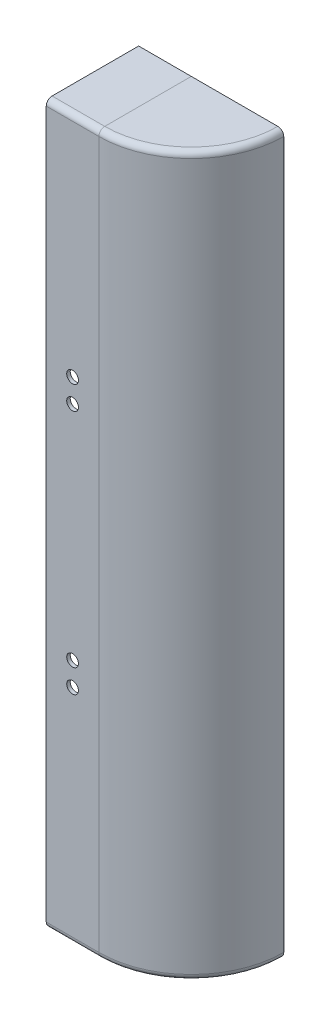
ISO-10303-21;
HEADER;
FILE_DESCRIPTION(('STEP AP214'),'2;1');
FILE_NAME('part.step','',(''),(''),'','','');
FILE_SCHEMA(('AUTOMOTIVE_DESIGN { 1 0 10303 214 1 1 1 1 }'));
ENDSEC;
DATA;
#1=APPLICATION_CONTEXT('core data for automotive mechanical design processes');
#2=APPLICATION_PROTOCOL_DEFINITION('international standard','automotive_design',2000,#1);
#3=PRODUCT_CONTEXT('',#1,'mechanical');
#4=PRODUCT('Part','Part','',(#3));
#5=PRODUCT_RELATED_PRODUCT_CATEGORY('part','',(#4));
#6=PRODUCT_DEFINITION_FORMATION('','',#4);
#7=PRODUCT_DEFINITION_CONTEXT('part definition',#1,'design');
#8=PRODUCT_DEFINITION('design','',#6,#7);
#9=PRODUCT_DEFINITION_SHAPE('','',#8);
#10=(LENGTH_UNIT() NAMED_UNIT(*) SI_UNIT(.MILLI.,.METRE.));
#11=(NAMED_UNIT(*) PLANE_ANGLE_UNIT() SI_UNIT($,.RADIAN.));
#12=(NAMED_UNIT(*) SI_UNIT($,.STERADIAN.) SOLID_ANGLE_UNIT());
#13=UNCERTAINTY_MEASURE_WITH_UNIT(LENGTH_MEASURE(1.E-05),#10,'distance_accuracy_value','');
#14=(GEOMETRIC_REPRESENTATION_CONTEXT(3) GLOBAL_UNCERTAINTY_ASSIGNED_CONTEXT((#13)) GLOBAL_UNIT_ASSIGNED_CONTEXT((#10,
#11,#12)) REPRESENTATION_CONTEXT('',''));
#15=CARTESIAN_POINT('',(0.,0.,0.));
#16=DIRECTION('',(0.,0.,1.));
#17=DIRECTION('',(1.,0.,0.));
#18=AXIS2_PLACEMENT_3D('',#15,#16,#17);
#19=CARTESIAN_POINT('',(5.00000000000474,267.103854728123,0.));
#20=DIRECTION('',(-1.,0.,0.));
#21=DIRECTION('',(0.,-1.,0.));
#22=AXIS2_PLACEMENT_3D('',#19,#20,#21);
#23=PLANE('',#22);
#24=DIRECTION('',(0.,1.,0.));
#25=VECTOR('',#24,1.);
#26=CARTESIAN_POINT('',(5.00000000000474,0.,1.5));
#27=LINE('',#26,#25);
#28=CARTESIAN_POINT('',(5.00000000000474,267.103854728123,1.49999999999999));
#29=VERTEX_POINT('',#28);
#30=CARTESIAN_POINT('',(5.00000000000474,-34.8961452718771,1.5));
#31=VERTEX_POINT('',#30);
#32=EDGE_CURVE('E482',#29,#31,#27,.F.);
#33=ORIENTED_EDGE('',*,*,#32,.F.);
#34=DIRECTION('',(0.,0.,-1.));
#35=VECTOR('',#34,1.);
#36=CARTESIAN_POINT('',(5.00000000000474,267.103854728123,0.));
#37=LINE('',#36,#35);
#38=CARTESIAN_POINT('',(5.00000000000474,267.103854728123,0.));
#39=VERTEX_POINT('',#38);
#40=EDGE_CURVE('E13',#29,#39,#37,.T.);
#41=ORIENTED_EDGE('',*,*,#40,.T.);
#42=DIRECTION('',(0.,-1.,0.));
#43=VECTOR('',#42,1.);
#44=CARTESIAN_POINT('',(5.00000000000474,267.103854728123,0.));
#45=LINE('',#44,#43);
#46=CARTESIAN_POINT('',(5.00000000000474,-34.8961452718771,0.));
#47=VERTEX_POINT('',#46);
#48=EDGE_CURVE('E460',#39,#47,#45,.T.);
#49=ORIENTED_EDGE('',*,*,#48,.T.);
#50=DIRECTION('',(0.,0.,-1.));
#51=VECTOR('',#50,1.);
#52=CARTESIAN_POINT('',(5.00000000000474,-34.8961452718771,0.));
#53=LINE('',#52,#51);
#54=EDGE_CURVE('E161',#31,#47,#53,.T.);
#55=ORIENTED_EDGE('',*,*,#54,.F.);
#56=EDGE_LOOP('',(#33,#41,#49,#55));
#57=FACE_BOUND('',#56,.T.);
#58=ADVANCED_FACE('F157',(#57),#23,.T.);
#59=CARTESIAN_POINT('',(16.2500000000044,57.6023073405395,0.));
#60=DIRECTION('',(0.,0.,1.));
#61=DIRECTION('',(1.,0.,0.));
#62=AXIS2_PLACEMENT_3D('',#59,#60,#61);
#63=CYLINDRICAL_SURFACE('',#62,2.5);
#64=CARTESIAN_POINT('',(16.2500000000044,57.6023073405395,0.));
#65=DIRECTION('',(0.,0.,1.));
#66=DIRECTION('',(1.,0.,0.));
#67=AXIS2_PLACEMENT_3D('',#64,#65,#66);
#68=CIRCLE('',#67,2.5);
#69=CARTESIAN_POINT('',(18.7500000000044,57.6023073405395,0.));
#70=VERTEX_POINT('',#69);
#71=EDGE_CURVE('E468',#70,#70,#68,.T.);
#72=ORIENTED_EDGE('',*,*,#71,.F.);
#73=EDGE_LOOP('',(#72));
#74=FACE_BOUND('',#73,.T.);
#75=CARTESIAN_POINT('',(16.2500000000044,57.6023073405395,1.5));
#76=DIRECTION('',(0.,0.,1.));
#77=DIRECTION('',(1.,0.,0.));
#78=AXIS2_PLACEMENT_3D('',#75,#76,#77);
#79=CIRCLE('',#78,2.5);
#80=CARTESIAN_POINT('',(18.7500000000044,57.6023073405395,1.5));
#81=VERTEX_POINT('',#80);
#82=EDGE_CURVE('E486',#81,#81,#79,.T.);
#83=ORIENTED_EDGE('',*,*,#82,.T.);
#84=EDGE_LOOP('',(#83));
#85=FACE_BOUND('',#84,.T.);
#86=ADVANCED_FACE('F521',(#74,#85),#63,.F.);
#87=CARTESIAN_POINT('',(16.2500000000045,67.6023073405395,0.));
#88=DIRECTION('',(0.,0.,1.));
#89=DIRECTION('',(1.,0.,0.));
#90=AXIS2_PLACEMENT_3D('',#87,#88,#89);
#91=CYLINDRICAL_SURFACE('',#90,2.5);
#92=CARTESIAN_POINT('',(16.2500000000045,67.6023073405395,0.));
#93=DIRECTION('',(0.,0.,1.));
#94=DIRECTION('',(1.,0.,0.));
#95=AXIS2_PLACEMENT_3D('',#92,#93,#94);
#96=CIRCLE('',#95,2.5);
#97=CARTESIAN_POINT('',(18.7500000000045,67.6023073405395,0.));
#98=VERTEX_POINT('',#97);
#99=EDGE_CURVE('E471',#98,#98,#96,.T.);
#100=ORIENTED_EDGE('',*,*,#99,.F.);
#101=EDGE_LOOP('',(#100));
#102=FACE_BOUND('',#101,.T.);
#103=CARTESIAN_POINT('',(16.2500000000045,67.6023073405395,1.5));
#104=DIRECTION('',(0.,0.,1.));
#105=DIRECTION('',(1.,0.,0.));
#106=AXIS2_PLACEMENT_3D('',#103,#104,#105);
#107=CIRCLE('',#106,2.5);
#108=CARTESIAN_POINT('',(18.7500000000045,67.6023073405395,1.5));
#109=VERTEX_POINT('',#108);
#110=EDGE_CURVE('E494',#109,#109,#107,.T.);
#111=ORIENTED_EDGE('',*,*,#110,.T.);
#112=EDGE_LOOP('',(#111));
#113=FACE_BOUND('',#112,.T.);
#114=ADVANCED_FACE('F526',(#102,#113),#91,.F.);
#115=CARTESIAN_POINT('',(16.2500000000051,162.445102934797,0.));
#116=DIRECTION('',(0.,0.,1.));
#117=DIRECTION('',(1.,0.,0.));
#118=AXIS2_PLACEMENT_3D('',#115,#116,#117);
#119=CYLINDRICAL_SURFACE('',#118,2.5);
#120=CARTESIAN_POINT('',(16.2500000000051,162.445102934797,0.));
#121=DIRECTION('',(0.,0.,1.));
#122=DIRECTION('',(1.,0.,0.));
#123=AXIS2_PLACEMENT_3D('',#120,#121,#122);
#124=CIRCLE('',#123,2.5);
#125=CARTESIAN_POINT('',(18.7500000000051,162.445102934797,0.));
#126=VERTEX_POINT('',#125);
#127=EDGE_CURVE('E474',#126,#126,#124,.T.);
#128=ORIENTED_EDGE('',*,*,#127,.F.);
#129=EDGE_LOOP('',(#128));
#130=FACE_BOUND('',#129,.T.);
#131=CARTESIAN_POINT('',(16.2500000000051,162.445102934797,1.5));
#132=DIRECTION('',(0.,0.,1.));
#133=DIRECTION('',(1.,0.,0.));
#134=AXIS2_PLACEMENT_3D('',#131,#132,#133);
#135=CIRCLE('',#134,2.5);
#136=CARTESIAN_POINT('',(18.7500000000051,162.445102934797,1.5));
#137=VERTEX_POINT('',#136);
#138=EDGE_CURVE('E497',#137,#137,#135,.T.);
#139=ORIENTED_EDGE('',*,*,#138,.T.);
#140=EDGE_LOOP('',(#139));
#141=FACE_BOUND('',#140,.T.);
#142=ADVANCED_FACE('F532',(#130,#141),#119,.F.);
#143=CARTESIAN_POINT('',(16.2500000000052,172.445102934797,0.));
#144=DIRECTION('',(0.,0.,1.));
#145=DIRECTION('',(1.,0.,0.));
#146=AXIS2_PLACEMENT_3D('',#143,#144,#145);
#147=CYLINDRICAL_SURFACE('',#146,2.5);
#148=CARTESIAN_POINT('',(16.2500000000052,172.445102934797,0.));
#149=DIRECTION('',(0.,0.,1.));
#150=DIRECTION('',(1.,0.,0.));
#151=AXIS2_PLACEMENT_3D('',#148,#149,#150);
#152=CIRCLE('',#151,2.5);
#153=CARTESIAN_POINT('',(18.7500000000052,172.445102934797,0.));
#154=VERTEX_POINT('',#153);
#155=EDGE_CURVE('E477',#154,#154,#152,.T.);
#156=ORIENTED_EDGE('',*,*,#155,.F.);
#157=EDGE_LOOP('',(#156));
#158=FACE_BOUND('',#157,.T.);
#159=CARTESIAN_POINT('',(16.2500000000052,172.445102934797,1.5));
#160=DIRECTION('',(0.,0.,1.));
#161=DIRECTION('',(1.,0.,0.));
#162=AXIS2_PLACEMENT_3D('',#159,#160,#161);
#163=CIRCLE('',#162,2.5);
#164=CARTESIAN_POINT('',(18.7500000000052,172.445102934797,1.5));
#165=VERTEX_POINT('',#164);
#166=EDGE_CURVE('E461',#165,#165,#163,.T.);
#167=ORIENTED_EDGE('',*,*,#166,.T.);
#168=EDGE_LOOP('',(#167));
#169=FACE_BOUND('',#168,.T.);
#170=ADVANCED_FACE('F159',(#158,#169),#147,.F.);
#171=CARTESIAN_POINT('',(0.,0.,0.));
#172=DIRECTION('',(0.,0.,1.));
#173=DIRECTION('',(1.,0.,0.));
#174=AXIS2_PLACEMENT_3D('',#171,#172,#173);
#175=PLANE('',#174);
#176=DIRECTION('',(1.,0.,0.));
#177=VECTOR('',#176,1.);
#178=CARTESIAN_POINT('',(5.00000000000474,-34.8961452718771,0.));
#179=LINE('',#178,#177);
#180=CARTESIAN_POINT('',(27.5000000000047,-34.8961452718772,0.));
#181=VERTEX_POINT('',#180);
#182=EDGE_CURVE('E172',#47,#181,#179,.T.);
#183=ORIENTED_EDGE('',*,*,#182,.F.);
#184=ORIENTED_EDGE('',*,*,#48,.F.);
#185=DIRECTION('',(-1.,0.,0.));
#186=VECTOR('',#185,1.);
#187=CARTESIAN_POINT('',(27.5000000000048,267.103854728123,0.));
#188=LINE('',#187,#186);
#189=CARTESIAN_POINT('',(27.5000000000049,267.103854728123,0.));
#190=VERTEX_POINT('',#189);
#191=EDGE_CURVE('E463',#190,#39,#188,.T.);
#192=ORIENTED_EDGE('',*,*,#191,.F.);
#193=DIRECTION('',(0.,1.,0.));
#194=VECTOR('',#193,1.);
#195=CARTESIAN_POINT('',(27.5000000000048,-34.8961452718772,0.));
#196=LINE('',#195,#194);
#197=EDGE_CURVE('E465',#181,#190,#196,.T.);
#198=ORIENTED_EDGE('',*,*,#197,.F.);
#199=EDGE_LOOP('',(#183,#184,#192,#198));
#200=FACE_BOUND('',#199,.T.);
#201=ORIENTED_EDGE('',*,*,#71,.T.);
#202=EDGE_LOOP('',(#201));
#203=FACE_BOUND('',#202,.T.);
#204=ORIENTED_EDGE('',*,*,#99,.T.);
#205=EDGE_LOOP('',(#204));
#206=FACE_BOUND('',#205,.T.);
#207=ORIENTED_EDGE('',*,*,#127,.T.);
#208=EDGE_LOOP('',(#207));
#209=FACE_BOUND('',#208,.T.);
#210=ORIENTED_EDGE('',*,*,#155,.T.);
#211=EDGE_LOOP('',(#210));
#212=FACE_BOUND('',#211,.T.);
#213=ADVANCED_FACE('F507',(#200,#203,#206,#209,#212),#175,.F.);
#214=CARTESIAN_POINT('',(0.,0.,1.5));
#215=DIRECTION('',(0.,0.,1.));
#216=DIRECTION('',(1.,0.,0.));
#217=AXIS2_PLACEMENT_3D('',#214,#215,#216);
#218=PLANE('',#217);
#219=DIRECTION('',(1.,0.,0.));
#220=VECTOR('',#219,1.);
#221=CARTESIAN_POINT('',(0.,-34.8961452718771,1.5));
#222=LINE('',#221,#220);
#223=CARTESIAN_POINT('',(27.5000000000048,-34.8961452718772,1.50000000000001));
#224=VERTEX_POINT('',#223);
#225=EDGE_CURVE('E451',#31,#224,#222,.T.);
#226=ORIENTED_EDGE('',*,*,#225,.T.);
#227=DIRECTION('',(0.,1.,0.));
#228=VECTOR('',#227,1.);
#229=CARTESIAN_POINT('',(27.5000000000048,0.,1.5));
#230=LINE('',#229,#228);
#231=CARTESIAN_POINT('',(27.5000000000049,267.103854728123,1.50000000000002));
#232=VERTEX_POINT('',#231);
#233=EDGE_CURVE('E483',#224,#232,#230,.T.);
#234=ORIENTED_EDGE('',*,*,#233,.T.);
#235=DIRECTION('',(1.,0.,0.));
#236=VECTOR('',#235,1.);
#237=CARTESIAN_POINT('',(0.,267.103854728123,1.5));
#238=LINE('',#237,#236);
#239=EDGE_CURVE('E487',#232,#29,#238,.F.);
#240=ORIENTED_EDGE('',*,*,#239,.T.);
#241=ORIENTED_EDGE('',*,*,#32,.T.);
#242=EDGE_LOOP('',(#226,#234,#240,#241));
#243=FACE_BOUND('',#242,.T.);
#244=ORIENTED_EDGE('',*,*,#82,.F.);
#245=EDGE_LOOP('',(#244));
#246=FACE_BOUND('',#245,.T.);
#247=ORIENTED_EDGE('',*,*,#110,.F.);
#248=EDGE_LOOP('',(#247));
#249=FACE_BOUND('',#248,.T.);
#250=ORIENTED_EDGE('',*,*,#138,.F.);
#251=EDGE_LOOP('',(#250));
#252=FACE_BOUND('',#251,.T.);
#253=ORIENTED_EDGE('',*,*,#166,.F.);
#254=EDGE_LOOP('',(#253));
#255=FACE_BOUND('',#254,.T.);
#256=ADVANCED_FACE('F504',(#243,#246,#249,#252,#255),#218,.T.);
#257=CARTESIAN_POINT('',(27.5000000000049,-34.8961452718772,-38.));
#258=DIRECTION('',(0.,-1.,0.));
#259=DIRECTION('',(1.,0.,0.));
#260=AXIS2_PLACEMENT_3D('',#257,#258,#259);
#261=CYLINDRICAL_SURFACE('',#260,39.5);
#262=ORIENTED_EDGE('',*,*,#233,.F.);
#263=CARTESIAN_POINT('',(27.5000000000049,-34.8961452718772,-38.));
#264=DIRECTION('',(0.,-1.,0.));
#265=DIRECTION('',(0.,0.,-1.));
#266=AXIS2_PLACEMENT_3D('',#263,#264,#265);
#267=CIRCLE('',#266,39.5);
#268=CARTESIAN_POINT('',(67.0000000000049,-34.8961452718772,-37.9999999999999));
#269=VERTEX_POINT('',#268);
#270=EDGE_CURVE('E452',#269,#224,#267,.T.);
#271=ORIENTED_EDGE('',*,*,#270,.F.);
#272=DIRECTION('',(0.,-1.,0.));
#273=VECTOR('',#272,1.);
#274=CARTESIAN_POINT('',(67.0000000000049,267.103854728123,-37.9999999999999));
#275=LINE('',#274,#273);
#276=CARTESIAN_POINT('',(67.0000000000049,267.103854728123,-37.9999999999999));
#277=VERTEX_POINT('',#276);
#278=EDGE_CURVE('E440',#269,#277,#275,.F.);
#279=ORIENTED_EDGE('',*,*,#278,.T.);
#280=CARTESIAN_POINT('',(27.5000000000049,267.103854728123,-38.));
#281=DIRECTION('',(0.,-1.,0.));
#282=DIRECTION('',(0.,0.,-1.));
#283=AXIS2_PLACEMENT_3D('',#280,#281,#282);
#284=CIRCLE('',#283,39.5);
#285=EDGE_CURVE('E449',#232,#277,#284,.F.);
#286=ORIENTED_EDGE('',*,*,#285,.F.);
#287=EDGE_LOOP('',(#262,#271,#279,#286));
#288=FACE_BOUND('',#287,.T.);
#289=ADVANCED_FACE('F506',(#288),#261,.T.);
#290=CARTESIAN_POINT('',(27.5000000000049,-34.8961452718772,-38.));
#291=DIRECTION('',(0.,-1.,0.));
#292=DIRECTION('',(1.,0.,0.));
#293=AXIS2_PLACEMENT_3D('',#290,#291,#292);
#294=CYLINDRICAL_SURFACE('',#293,38.);
#295=ORIENTED_EDGE('',*,*,#197,.T.);
#296=CARTESIAN_POINT('',(27.5000000000049,267.103854728123,-38.));
#297=DIRECTION('',(0.,-1.,0.));
#298=DIRECTION('',(0.,0.,-1.));
#299=AXIS2_PLACEMENT_3D('',#296,#297,#298);
#300=CIRCLE('',#299,38.);
#301=CARTESIAN_POINT('',(65.5000000000049,267.103854728123,-37.9999999999999));
#302=VERTEX_POINT('',#301);
#303=EDGE_CURVE('E455',#190,#302,#300,.F.);
#304=ORIENTED_EDGE('',*,*,#303,.T.);
#305=DIRECTION('',(0.,-1.,0.));
#306=VECTOR('',#305,1.);
#307=CARTESIAN_POINT('',(65.5000000000049,267.103854728123,-37.9999999999999));
#308=LINE('',#307,#306);
#309=CARTESIAN_POINT('',(65.5000000000049,-34.8961452718772,-37.9999999999999));
#310=VERTEX_POINT('',#309);
#311=EDGE_CURVE('E445',#302,#310,#308,.T.);
#312=ORIENTED_EDGE('',*,*,#311,.T.);
#313=CARTESIAN_POINT('',(27.5000000000049,-34.8961452718772,-38.));
#314=DIRECTION('',(0.,-1.,0.));
#315=DIRECTION('',(0.,0.,-1.));
#316=AXIS2_PLACEMENT_3D('',#313,#314,#315);
#317=CIRCLE('',#316,38.);
#318=EDGE_CURVE('E302',#310,#181,#317,.T.);
#319=ORIENTED_EDGE('',*,*,#318,.T.);
#320=EDGE_LOOP('',(#295,#304,#312,#319));
#321=FACE_BOUND('',#320,.T.);
#322=ADVANCED_FACE('F514',(#321),#294,.F.);
#323=CARTESIAN_POINT('',(67.0000000000048,-34.8961452718772,-38.01));
#324=DIRECTION('',(0.,1.,0.));
#325=DIRECTION('',(0.,0.,1.));
#326=AXIS2_PLACEMENT_3D('',#323,#324,#325);
#327=PLANE('',#326);
#328=DIRECTION('',(-1.,0.,0.));
#329=VECTOR('',#328,1.);
#330=CARTESIAN_POINT('',(65.5000000000049,-34.8961452718772,-37.9999999999999));
#331=LINE('',#330,#329);
#332=EDGE_CURVE('E443',#310,#269,#331,.F.);
#333=ORIENTED_EDGE('',*,*,#332,.F.);
#334=DIRECTION('',(0.,0.,1.));
#335=VECTOR('',#334,1.);
#336=CARTESIAN_POINT('',(65.5000000000049,-34.8961452718772,-38.01));
#337=LINE('',#336,#335);
#338=CARTESIAN_POINT('',(65.5000000000049,-34.8961452718772,-38.01));
#339=VERTEX_POINT('',#338);
#340=EDGE_CURVE('E438',#310,#339,#337,.F.);
#341=ORIENTED_EDGE('',*,*,#340,.T.);
#342=DIRECTION('',(-1.,0.,0.));
#343=VECTOR('',#342,1.);
#344=CARTESIAN_POINT('',(67.0000000000048,-34.8961452718772,-38.01));
#345=LINE('',#344,#343);
#346=CARTESIAN_POINT('',(67.0000000000049,-34.8961452718772,-38.01));
#347=VERTEX_POINT('',#346);
#348=EDGE_CURVE('E420',#347,#339,#345,.T.);
#349=ORIENTED_EDGE('',*,*,#348,.F.);
#350=DIRECTION('',(0.,0.,-1.));
#351=VECTOR('',#350,1.);
#352=CARTESIAN_POINT('',(67.0000000000047,-34.8961452718772,0.));
#353=LINE('',#352,#351);
#354=EDGE_CURVE('E431',#269,#347,#353,.T.);
#355=ORIENTED_EDGE('',*,*,#354,.F.);
#356=EDGE_LOOP('',(#333,#341,#349,#355));
#357=FACE_BOUND('',#356,.T.);
#358=ADVANCED_FACE('F579',(#357),#327,.F.);
#359=CARTESIAN_POINT('',(67.0000000000047,267.103854728123,0.));
#360=DIRECTION('',(0.,-1.,0.));
#361=DIRECTION('',(0.,0.,-1.));
#362=AXIS2_PLACEMENT_3D('',#359,#360,#361);
#363=PLANE('',#362);
#364=DIRECTION('',(-1.,0.,0.));
#365=VECTOR('',#364,1.);
#366=CARTESIAN_POINT('',(67.0000000000048,267.103854728123,-37.9999999999999));
#367=LINE('',#366,#365);
#368=EDGE_CURVE('E418',#302,#277,#367,.F.);
#369=ORIENTED_EDGE('',*,*,#368,.T.);
#370=DIRECTION('',(0.,0.,1.));
#371=VECTOR('',#370,1.);
#372=CARTESIAN_POINT('',(67.0000000000047,267.103854728123,1.0062191195281E-13));
#373=LINE('',#372,#371);
#374=CARTESIAN_POINT('',(67.0000000000049,267.103854728123,-38.01));
#375=VERTEX_POINT('',#374);
#376=EDGE_CURVE('E426',#375,#277,#373,.T.);
#377=ORIENTED_EDGE('',*,*,#376,.F.);
#378=DIRECTION('',(-1.,0.,0.));
#379=VECTOR('',#378,1.);
#380=CARTESIAN_POINT('',(67.0000000000049,267.103854728123,-38.01));
#381=LINE('',#380,#379);
#382=CARTESIAN_POINT('',(65.5000000000049,267.103854728123,-38.01));
#383=VERTEX_POINT('',#382);
#384=EDGE_CURVE('E423',#375,#383,#381,.T.);
#385=ORIENTED_EDGE('',*,*,#384,.T.);
#386=DIRECTION('',(0.,0.,-1.));
#387=VECTOR('',#386,1.);
#388=CARTESIAN_POINT('',(65.5000000000047,267.103854728123,0.));
#389=LINE('',#388,#387);
#390=EDGE_CURVE('E433',#383,#302,#389,.F.);
#391=ORIENTED_EDGE('',*,*,#390,.T.);
#392=EDGE_LOOP('',(#369,#377,#385,#391));
#393=FACE_BOUND('',#392,.T.);
#394=ADVANCED_FACE('F590',(#393),#363,.F.);
#395=CARTESIAN_POINT('',(67.0000000000047,0.,1.0062191195281E-13));
#396=DIRECTION('',(-1.,0.,0.));
#397=DIRECTION('',(0.,0.,1.));
#398=AXIS2_PLACEMENT_3D('',#395,#396,#397);
#399=PLANE('',#398);
#400=ORIENTED_EDGE('',*,*,#278,.F.);
#401=ORIENTED_EDGE('',*,*,#354,.T.);
#402=DIRECTION('',(0.,1.,0.));
#403=VECTOR('',#402,1.);
#404=CARTESIAN_POINT('',(67.0000000000049,0.,-38.01));
#405=LINE('',#404,#403);
#406=EDGE_CURVE('E429',#347,#375,#405,.T.);
#407=ORIENTED_EDGE('',*,*,#406,.T.);
#408=ORIENTED_EDGE('',*,*,#376,.T.);
#409=EDGE_LOOP('',(#400,#401,#407,#408));
#410=FACE_BOUND('',#409,.T.);
#411=ADVANCED_FACE('F599',(#410),#399,.F.);
#412=CARTESIAN_POINT('',(65.5000000000047,0.,0.));
#413=DIRECTION('',(-1.,0.,0.));
#414=DIRECTION('',(0.,0.,1.));
#415=AXIS2_PLACEMENT_3D('',#412,#413,#414);
#416=PLANE('',#415);
#417=ORIENTED_EDGE('',*,*,#340,.F.);
#418=ORIENTED_EDGE('',*,*,#311,.F.);
#419=ORIENTED_EDGE('',*,*,#390,.F.);
#420=DIRECTION('',(0.,-1.,0.));
#421=VECTOR('',#420,1.);
#422=CARTESIAN_POINT('',(65.5000000000049,267.103854728123,-38.01));
#423=LINE('',#422,#421);
#424=EDGE_CURVE('E436',#339,#383,#423,.F.);
#425=ORIENTED_EDGE('',*,*,#424,.F.);
#426=EDGE_LOOP('',(#417,#418,#419,#425));
#427=FACE_BOUND('',#426,.T.);
#428=ADVANCED_FACE('F604',(#427),#416,.T.);
#429=CARTESIAN_POINT('',(67.0000000000048,267.103854728123,-38.01));
#430=DIRECTION('',(0.,0.,1.));
#431=DIRECTION('',(1.,0.,0.));
#432=AXIS2_PLACEMENT_3D('',#429,#430,#431);
#433=PLANE('',#432);
#434=ORIENTED_EDGE('',*,*,#424,.T.);
#435=ORIENTED_EDGE('',*,*,#384,.F.);
#436=ORIENTED_EDGE('',*,*,#406,.F.);
#437=ORIENTED_EDGE('',*,*,#348,.T.);
#438=EDGE_LOOP('',(#434,#435,#436,#437));
#439=FACE_BOUND('',#438,.T.);
#440=ADVANCED_FACE('F615',(#439),#433,.F.);
#441=CARTESIAN_POINT('',(5.00000000000474,267.103854728123,-1.00000000000001));
#442=DIRECTION('',(-1.,0.,0.));
#443=DIRECTION('',(0.,0.,1.));
#444=AXIS2_PLACEMENT_3D('',#441,#442,#443);
#445=PLANE('',#444);
#446=ORIENTED_EDGE('',*,*,#40,.F.);
#447=CARTESIAN_POINT('',(5.00000000000474,267.103854728123,-1.00000000000001));
#448=DIRECTION('',(1.,0.,0.));
#449=DIRECTION('',(0.,0.,-1.));
#450=AXIS2_PLACEMENT_3D('',#447,#448,#449);
#451=CIRCLE('',#450,2.5);
#452=CARTESIAN_POINT('',(5.00000000000474,269.603854728123,-1.00000000000001));
#453=VERTEX_POINT('',#452);
#454=EDGE_CURVE('E357',#29,#453,#451,.F.);
#455=ORIENTED_EDGE('',*,*,#454,.T.);
#456=DIRECTION('',(0.,-1.,0.));
#457=VECTOR('',#456,1.);
#458=CARTESIAN_POINT('',(5.00000000000474,268.103854728123,-1.00000000000001));
#459=LINE('',#458,#457);
#460=CARTESIAN_POINT('',(5.00000000000474,268.103854728123,-1.00000000000001));
#461=VERTEX_POINT('',#460);
#462=EDGE_CURVE('E416',#453,#461,#459,.T.);
#463=ORIENTED_EDGE('',*,*,#462,.T.);
#464=CARTESIAN_POINT('',(5.00000000000474,267.103854728123,-1.00000000000001));
#465=DIRECTION('',(1.,0.,0.));
#466=DIRECTION('',(0.,0.,-1.));
#467=AXIS2_PLACEMENT_3D('',#464,#465,#466);
#468=CIRCLE('',#467,1.);
#469=EDGE_CURVE('E359',#39,#461,#468,.F.);
#470=ORIENTED_EDGE('',*,*,#469,.F.);
#471=EDGE_LOOP('',(#446,#455,#463,#470));
#472=FACE_BOUND('',#471,.T.);
#473=ADVANCED_FACE('F886',(#472),#445,.T.);
#474=CARTESIAN_POINT('',(5.00000000000474,268.103854728123,0.));
#475=DIRECTION('',(-1.,0.,0.));
#476=DIRECTION('',(0.,0.,-1.));
#477=AXIS2_PLACEMENT_3D('',#474,#475,#476);
#478=PLANE('',#477);
#479=ORIENTED_EDGE('',*,*,#462,.F.);
#480=DIRECTION('',(0.,0.,-1.));
#481=VECTOR('',#480,1.);
#482=CARTESIAN_POINT('',(5.00000000000474,269.603854728123,0.));
#483=LINE('',#482,#481);
#484=CARTESIAN_POINT('',(5.00000000000476,269.603854728123,-38.));
#485=VERTEX_POINT('',#484);
#486=EDGE_CURVE('E400',#453,#485,#483,.T.);
#487=ORIENTED_EDGE('',*,*,#486,.T.);
#488=DIRECTION('',(0.,-1.,0.));
#489=VECTOR('',#488,1.);
#490=CARTESIAN_POINT('',(5.00000000000476,268.103854728123,-38.));
#491=LINE('',#490,#489);
#492=CARTESIAN_POINT('',(5.00000000000476,268.103854728123,-38.));
#493=VERTEX_POINT('',#492);
#494=EDGE_CURVE('E414',#485,#493,#491,.T.);
#495=ORIENTED_EDGE('',*,*,#494,.T.);
#496=DIRECTION('',(0.,0.,-1.));
#497=VECTOR('',#496,1.);
#498=CARTESIAN_POINT('',(5.00000000000474,268.103854728123,0.));
#499=LINE('',#498,#497);
#500=EDGE_CURVE('E362',#461,#493,#499,.T.);
#501=ORIENTED_EDGE('',*,*,#500,.F.);
#502=EDGE_LOOP('',(#479,#487,#495,#501));
#503=FACE_BOUND('',#502,.T.);
#504=ADVANCED_FACE('F876',(#503),#478,.T.);
#505=CARTESIAN_POINT('',(5.00000000000476,268.103854728123,-38.));
#506=DIRECTION('',(0.,0.,-1.));
#507=DIRECTION('',(1.,0.,0.));
#508=AXIS2_PLACEMENT_3D('',#505,#506,#507);
#509=PLANE('',#508);
#510=ORIENTED_EDGE('',*,*,#494,.F.);
#511=DIRECTION('',(1.,0.,0.));
#512=VECTOR('',#511,1.);
#513=CARTESIAN_POINT('',(5.00000000000474,269.603854728123,-38.));
#514=LINE('',#513,#512);
#515=CARTESIAN_POINT('',(27.5000000000049,269.603854728123,-38.));
#516=VERTEX_POINT('',#515);
#517=EDGE_CURVE('E391',#485,#516,#514,.T.);
#518=ORIENTED_EDGE('',*,*,#517,.T.);
#519=DIRECTION('',(0.,-1.,0.));
#520=VECTOR('',#519,1.);
#521=CARTESIAN_POINT('',(27.5000000000049,268.103854728123,-38.));
#522=LINE('',#521,#520);
#523=CARTESIAN_POINT('',(27.5000000000049,268.103854728123,-38.));
#524=VERTEX_POINT('',#523);
#525=EDGE_CURVE('E412',#516,#524,#522,.T.);
#526=ORIENTED_EDGE('',*,*,#525,.T.);
#527=DIRECTION('',(1.,0.,0.));
#528=VECTOR('',#527,1.);
#529=CARTESIAN_POINT('',(5.00000000000476,268.103854728123,-38.));
#530=LINE('',#529,#528);
#531=EDGE_CURVE('E375',#493,#524,#530,.T.);
#532=ORIENTED_EDGE('',*,*,#531,.F.);
#533=EDGE_LOOP('',(#510,#518,#526,#532));
#534=FACE_BOUND('',#533,.T.);
#535=ADVANCED_FACE('F866',(#534),#509,.T.);
#536=CARTESIAN_POINT('',(65.5000000000049,268.103854728123,-37.9999999999999));
#537=DIRECTION('',(0.,0.,1.));
#538=DIRECTION('',(-1.,0.,0.));
#539=AXIS2_PLACEMENT_3D('',#536,#537,#538);
#540=PLANE('',#539);
#541=ORIENTED_EDGE('',*,*,#525,.F.);
#542=DIRECTION('',(1.,0.,0.));
#543=VECTOR('',#542,1.);
#544=CARTESIAN_POINT('',(27.5000000000049,269.603854728123,-37.9999999999999));
#545=LINE('',#544,#543);
#546=CARTESIAN_POINT('',(64.5000000000049,269.603854728123,-37.9999999999999));
#547=VERTEX_POINT('',#546);
#548=EDGE_CURVE('E363',#547,#516,#545,.F.);
#549=ORIENTED_EDGE('',*,*,#548,.F.);
#550=DIRECTION('',(0.,-1.,0.));
#551=VECTOR('',#550,1.);
#552=CARTESIAN_POINT('',(64.5000000000049,268.103854728123,-37.9999999999999));
#553=LINE('',#552,#551);
#554=CARTESIAN_POINT('',(64.5000000000049,268.103854728123,-37.9999999999999));
#555=VERTEX_POINT('',#554);
#556=EDGE_CURVE('E387',#547,#555,#553,.T.);
#557=ORIENTED_EDGE('',*,*,#556,.T.);
#558=DIRECTION('',(-1.,0.,0.));
#559=VECTOR('',#558,1.);
#560=CARTESIAN_POINT('',(65.5000000000049,268.103854728123,-37.9999999999999));
#561=LINE('',#560,#559);
#562=EDGE_CURVE('E378',#555,#524,#561,.T.);
#563=ORIENTED_EDGE('',*,*,#562,.T.);
#564=EDGE_LOOP('',(#541,#549,#557,#563));
#565=FACE_BOUND('',#564,.T.);
#566=ADVANCED_FACE('F856',(#565),#540,.F.);
#567=CARTESIAN_POINT('',(64.5000000000049,267.103854728123,-37.9999999999999));
#568=DIRECTION('',(0.,0.,1.));
#569=DIRECTION('',(1.,0.,0.));
#570=AXIS2_PLACEMENT_3D('',#567,#568,#569);
#571=PLANE('',#570);
#572=CARTESIAN_POINT('',(64.5000000000049,267.103854728123,-37.9999999999999));
#573=DIRECTION('',(0.,0.,1.));
#574=DIRECTION('',(1.,0.,0.));
#575=AXIS2_PLACEMENT_3D('',#572,#573,#574);
#576=CIRCLE('',#575,2.5);
#577=EDGE_CURVE('E396',#277,#547,#576,.T.);
#578=ORIENTED_EDGE('',*,*,#577,.F.);
#579=ORIENTED_EDGE('',*,*,#368,.F.);
#580=CARTESIAN_POINT('',(64.5000000000049,267.103854728123,-37.9999999999999));
#581=DIRECTION('',(0.,0.,-1.));
#582=DIRECTION('',(-1.,0.,0.));
#583=AXIS2_PLACEMENT_3D('',#580,#581,#582);
#584=CIRCLE('',#583,1.);
#585=EDGE_CURVE('E371',#302,#555,#584,.F.);
#586=ORIENTED_EDGE('',*,*,#585,.T.);
#587=ORIENTED_EDGE('',*,*,#556,.F.);
#588=EDGE_LOOP('',(#578,#579,#586,#587));
#589=FACE_BOUND('',#588,.T.);
#590=ADVANCED_FACE('F846',(#589),#571,.F.);
#591=CARTESIAN_POINT('',(27.5000000000049,268.103854728123,0.));
#592=DIRECTION('',(0.,-1.,0.));
#593=DIRECTION('',(0.,0.,-1.));
#594=AXIS2_PLACEMENT_3D('',#591,#592,#593);
#595=PLANE('',#594);
#596=DIRECTION('',(0.,0.,-1.));
#597=VECTOR('',#596,1.);
#598=CARTESIAN_POINT('',(27.5000000000049,268.103854728123,0.));
#599=LINE('',#598,#597);
#600=CARTESIAN_POINT('',(27.5000000000049,268.103854728123,-1.00000000000001));
#601=VERTEX_POINT('',#600);
#602=EDGE_CURVE('E370',#601,#524,#599,.T.);
#603=ORIENTED_EDGE('',*,*,#602,.T.);
#604=ORIENTED_EDGE('',*,*,#562,.F.);
#605=CARTESIAN_POINT('',(27.5000000000049,268.103854728123,-38.));
#606=DIRECTION('',(0.,1.,0.));
#607=DIRECTION('',(0.,0.,1.));
#608=AXIS2_PLACEMENT_3D('',#605,#606,#607);
#609=CIRCLE('',#608,37.);
#610=EDGE_CURVE('E374',#601,#555,#609,.T.);
#611=ORIENTED_EDGE('',*,*,#610,.F.);
#612=EDGE_LOOP('',(#603,#604,#611));
#613=FACE_BOUND('',#612,.T.);
#614=ADVANCED_FACE('F836',(#613),#595,.T.);
#615=CARTESIAN_POINT('',(27.5000000000049,267.103854728123,-38.));
#616=DIRECTION('',(0.,1.,0.));
#617=DIRECTION('',(0.,0.,1.));
#618=AXIS2_PLACEMENT_3D('',#615,#616,#617);
#619=TOROIDAL_SURFACE('',#618,37.,1.);
#620=ORIENTED_EDGE('',*,*,#610,.T.);
#621=ORIENTED_EDGE('',*,*,#585,.F.);
#622=ORIENTED_EDGE('',*,*,#303,.F.);
#623=CARTESIAN_POINT('',(27.5000000000048,267.103854728123,-1.));
#624=DIRECTION('',(1.,0.,0.));
#625=DIRECTION('',(0.,0.,-1.));
#626=AXIS2_PLACEMENT_3D('',#623,#624,#625);
#627=CIRCLE('',#626,1.);
#628=EDGE_CURVE('E364',#190,#601,#627,.F.);
#629=ORIENTED_EDGE('',*,*,#628,.T.);
#630=EDGE_LOOP('',(#620,#621,#622,#629));
#631=FACE_BOUND('',#630,.T.);
#632=ADVANCED_FACE('F826',(#631),#619,.F.);
#633=CARTESIAN_POINT('',(5.00000000000474,268.103854728123,0.));
#634=DIRECTION('',(0.,-1.,0.));
#635=DIRECTION('',(0.,0.,-1.));
#636=AXIS2_PLACEMENT_3D('',#633,#634,#635);
#637=PLANE('',#636);
#638=ORIENTED_EDGE('',*,*,#531,.T.);
#639=ORIENTED_EDGE('',*,*,#602,.F.);
#640=DIRECTION('',(1.,0.,0.));
#641=VECTOR('',#640,1.);
#642=CARTESIAN_POINT('',(5.00000000000474,268.103854728123,-1.00000000000001));
#643=LINE('',#642,#641);
#644=EDGE_CURVE('E367',#461,#601,#643,.T.);
#645=ORIENTED_EDGE('',*,*,#644,.F.);
#646=ORIENTED_EDGE('',*,*,#500,.T.);
#647=EDGE_LOOP('',(#638,#639,#645,#646));
#648=FACE_BOUND('',#647,.T.);
#649=ADVANCED_FACE('F816',(#648),#637,.T.);
#650=CARTESIAN_POINT('',(5.00000000000474,267.103854728123,-1.00000000000001));
#651=DIRECTION('',(1.,0.,0.));
#652=DIRECTION('',(0.,0.,-1.));
#653=AXIS2_PLACEMENT_3D('',#650,#651,#652);
#654=CYLINDRICAL_SURFACE('',#653,1.);
#655=ORIENTED_EDGE('',*,*,#644,.T.);
#656=ORIENTED_EDGE('',*,*,#628,.F.);
#657=ORIENTED_EDGE('',*,*,#191,.T.);
#658=ORIENTED_EDGE('',*,*,#469,.T.);
#659=EDGE_LOOP('',(#655,#656,#657,#658));
#660=FACE_BOUND('',#659,.T.);
#661=ADVANCED_FACE('F806',(#660),#654,.F.);
#662=CARTESIAN_POINT('',(27.5000000000049,269.603854728123,0.));
#663=DIRECTION('',(0.,-1.,0.));
#664=DIRECTION('',(0.,0.,-1.));
#665=AXIS2_PLACEMENT_3D('',#662,#663,#664);
#666=PLANE('',#665);
#667=DIRECTION('',(0.,0.,-1.));
#668=VECTOR('',#667,1.);
#669=CARTESIAN_POINT('',(27.5000000000049,269.603854728123,0.));
#670=LINE('',#669,#668);
#671=CARTESIAN_POINT('',(27.5000000000049,269.603854728123,-1.00000000000001));
#672=VERTEX_POINT('',#671);
#673=EDGE_CURVE('E388',#672,#516,#670,.T.);
#674=ORIENTED_EDGE('',*,*,#673,.F.);
#675=CARTESIAN_POINT('',(27.5000000000049,269.603854728123,-38.));
#676=DIRECTION('',(0.,1.,0.));
#677=DIRECTION('',(0.,0.,1.));
#678=AXIS2_PLACEMENT_3D('',#675,#676,#677);
#679=CIRCLE('',#678,37.);
#680=EDGE_CURVE('E393',#672,#547,#679,.T.);
#681=ORIENTED_EDGE('',*,*,#680,.T.);
#682=ORIENTED_EDGE('',*,*,#548,.T.);
#683=EDGE_LOOP('',(#674,#681,#682));
#684=FACE_BOUND('',#683,.T.);
#685=ADVANCED_FACE('F796',(#684),#666,.F.);
#686=CARTESIAN_POINT('',(27.5000000000049,267.103854728123,-38.));
#687=DIRECTION('',(0.,1.,0.));
#688=DIRECTION('',(0.,0.,1.));
#689=AXIS2_PLACEMENT_3D('',#686,#687,#688);
#690=TOROIDAL_SURFACE('',#689,37.,2.5);
#691=ORIENTED_EDGE('',*,*,#680,.F.);
#692=CARTESIAN_POINT('',(27.5000000000049,267.103854728123,-0.999999999999987));
#693=DIRECTION('',(-1.,0.,0.));
#694=DIRECTION('',(0.,0.,1.));
#695=AXIS2_PLACEMENT_3D('',#692,#693,#694);
#696=CIRCLE('',#695,2.5);
#697=EDGE_CURVE('E397',#232,#672,#696,.T.);
#698=ORIENTED_EDGE('',*,*,#697,.F.);
#699=ORIENTED_EDGE('',*,*,#285,.T.);
#700=ORIENTED_EDGE('',*,*,#577,.T.);
#701=EDGE_LOOP('',(#691,#698,#699,#700));
#702=FACE_BOUND('',#701,.T.);
#703=ADVANCED_FACE('F786',(#702),#690,.T.);
#704=CARTESIAN_POINT('',(5.00000000000474,269.603854728123,0.));
#705=DIRECTION('',(0.,-1.,0.));
#706=DIRECTION('',(0.,0.,-1.));
#707=AXIS2_PLACEMENT_3D('',#704,#705,#706);
#708=PLANE('',#707);
#709=ORIENTED_EDGE('',*,*,#517,.F.);
#710=ORIENTED_EDGE('',*,*,#486,.F.);
#711=DIRECTION('',(1.,0.,0.));
#712=VECTOR('',#711,1.);
#713=CARTESIAN_POINT('',(5.00000000000474,269.603854728123,-1.00000000000001));
#714=LINE('',#713,#712);
#715=EDGE_CURVE('E392',#453,#672,#714,.T.);
#716=ORIENTED_EDGE('',*,*,#715,.T.);
#717=ORIENTED_EDGE('',*,*,#673,.T.);
#718=EDGE_LOOP('',(#709,#710,#716,#717));
#719=FACE_BOUND('',#718,.T.);
#720=ADVANCED_FACE('F777',(#719),#708,.F.);
#721=CARTESIAN_POINT('',(5.00000000000474,267.103854728123,-1.00000000000001));
#722=DIRECTION('',(1.,0.,0.));
#723=DIRECTION('',(0.,0.,-1.));
#724=AXIS2_PLACEMENT_3D('',#721,#722,#723);
#725=CYLINDRICAL_SURFACE('',#724,2.5);
#726=ORIENTED_EDGE('',*,*,#715,.F.);
#727=ORIENTED_EDGE('',*,*,#454,.F.);
#728=ORIENTED_EDGE('',*,*,#239,.F.);
#729=ORIENTED_EDGE('',*,*,#697,.T.);
#730=EDGE_LOOP('',(#726,#727,#728,#729));
#731=FACE_BOUND('',#730,.T.);
#732=ADVANCED_FACE('F629',(#731),#725,.T.);
#733=CARTESIAN_POINT('',(5.00000000000474,-34.8961452718771,-1.));
#734=DIRECTION('',(1.,0.,0.));
#735=DIRECTION('',(0.,1.,0.));
#736=AXIS2_PLACEMENT_3D('',#733,#734,#735);
#737=PLANE('',#736);
#738=DIRECTION('',(0.,1.,0.));
#739=VECTOR('',#738,1.);
#740=CARTESIAN_POINT('',(5.00000000000474,-35.8961452718771,-1.));
#741=LINE('',#740,#739);
#742=CARTESIAN_POINT('',(5.00000000000473,-37.3961452718771,-1.));
#743=VERTEX_POINT('',#742);
#744=CARTESIAN_POINT('',(5.00000000000474,-35.8961452718771,-1.));
#745=VERTEX_POINT('',#744);
#746=EDGE_CURVE('E290',#743,#745,#741,.T.);
#747=ORIENTED_EDGE('',*,*,#746,.F.);
#748=CARTESIAN_POINT('',(5.00000000000474,-34.8961452718771,-1.));
#749=DIRECTION('',(-1.,0.,0.));
#750=DIRECTION('',(0.,-1.,0.));
#751=AXIS2_PLACEMENT_3D('',#748,#749,#750);
#752=CIRCLE('',#751,2.5);
#753=EDGE_CURVE('E337',#31,#743,#752,.F.);
#754=ORIENTED_EDGE('',*,*,#753,.F.);
#755=ORIENTED_EDGE('',*,*,#54,.T.);
#756=CARTESIAN_POINT('',(5.00000000000474,-34.8961452718771,-1.));
#757=DIRECTION('',(-1.,0.,0.));
#758=DIRECTION('',(0.,-1.,0.));
#759=AXIS2_PLACEMENT_3D('',#756,#757,#758);
#760=CIRCLE('',#759,1.);
#761=EDGE_CURVE('E317',#47,#745,#760,.F.);
#762=ORIENTED_EDGE('',*,*,#761,.T.);
#763=EDGE_LOOP('',(#747,#754,#755,#762));
#764=FACE_BOUND('',#763,.T.);
#765=ADVANCED_FACE('F624',(#764),#737,.F.);
#766=CARTESIAN_POINT('',(64.5000000000049,-34.8961452718772,-37.9999999999999));
#767=DIRECTION('',(0.,0.,-1.));
#768=DIRECTION('',(-1.,0.,0.));
#769=AXIS2_PLACEMENT_3D('',#766,#767,#768);
#770=PLANE('',#769);
#771=ORIENTED_EDGE('',*,*,#332,.T.);
#772=CARTESIAN_POINT('',(64.5000000000049,-34.8961452718772,-37.9999999999999));
#773=DIRECTION('',(0.,0.,-1.));
#774=DIRECTION('',(-1.,0.,0.));
#775=AXIS2_PLACEMENT_3D('',#772,#773,#774);
#776=CIRCLE('',#775,2.5);
#777=CARTESIAN_POINT('',(64.5000000000049,-37.3961452718772,-37.9999999999999));
#778=VERTEX_POINT('',#777);
#779=EDGE_CURVE('E285',#269,#778,#776,.T.);
#780=ORIENTED_EDGE('',*,*,#779,.T.);
#781=DIRECTION('',(0.,1.,0.));
#782=VECTOR('',#781,1.);
#783=CARTESIAN_POINT('',(64.5000000000049,-35.8961452718772,-37.9999999999999));
#784=LINE('',#783,#782);
#785=CARTESIAN_POINT('',(64.5000000000049,-35.8961452718772,-37.9999999999999));
#786=VERTEX_POINT('',#785);
#787=EDGE_CURVE('E279',#778,#786,#784,.T.);
#788=ORIENTED_EDGE('',*,*,#787,.T.);
#789=CARTESIAN_POINT('',(64.5000000000049,-34.8961452718772,-37.9999999999999));
#790=DIRECTION('',(0.,0.,1.));
#791=DIRECTION('',(0.,-1.,0.));
#792=AXIS2_PLACEMENT_3D('',#789,#790,#791);
#793=CIRCLE('',#792,1.);
#794=EDGE_CURVE('E283',#310,#786,#793,.F.);
#795=ORIENTED_EDGE('',*,*,#794,.F.);
#796=EDGE_LOOP('',(#771,#780,#788,#795));
#797=FACE_BOUND('',#796,.T.);
#798=ADVANCED_FACE('F282',(#797),#770,.T.);
#799=CARTESIAN_POINT('',(65.5000000000049,-35.8961452718772,-37.9999999999999));
#800=DIRECTION('',(0.,0.,-1.));
#801=DIRECTION('',(-1.,0.,0.));
#802=AXIS2_PLACEMENT_3D('',#799,#800,#801);
#803=PLANE('',#802);
#804=ORIENTED_EDGE('',*,*,#787,.F.);
#805=DIRECTION('',(1.,0.,0.));
#806=VECTOR('',#805,1.);
#807=CARTESIAN_POINT('',(65.5000000000049,-37.3961452718772,-37.9999999999999));
#808=LINE('',#807,#806);
#809=CARTESIAN_POINT('',(27.5000000000049,-37.3961452718772,-38.));
#810=VERTEX_POINT('',#809);
#811=EDGE_CURVE('E345',#778,#810,#808,.F.);
#812=ORIENTED_EDGE('',*,*,#811,.T.);
#813=DIRECTION('',(0.,1.,0.));
#814=VECTOR('',#813,1.);
#815=CARTESIAN_POINT('',(27.5000000000049,-35.8961452718772,-38.));
#816=LINE('',#815,#814);
#817=CARTESIAN_POINT('',(27.5000000000049,-35.8961452718772,-38.));
#818=VERTEX_POINT('',#817);
#819=EDGE_CURVE('E291',#810,#818,#816,.T.);
#820=ORIENTED_EDGE('',*,*,#819,.T.);
#821=DIRECTION('',(-1.,0.,0.));
#822=VECTOR('',#821,1.);
#823=CARTESIAN_POINT('',(65.5000000000049,-35.8961452718772,-37.9999999999999));
#824=LINE('',#823,#822);
#825=EDGE_CURVE('E303',#786,#818,#824,.T.);
#826=ORIENTED_EDGE('',*,*,#825,.F.);
#827=EDGE_LOOP('',(#804,#812,#820,#826));
#828=FACE_BOUND('',#827,.T.);
#829=ADVANCED_FACE('F307',(#828),#803,.T.);
#830=CARTESIAN_POINT('',(27.5000000000049,-35.8961452718772,-38.));
#831=DIRECTION('',(0.,0.,-1.));
#832=DIRECTION('',(-1.,0.,0.));
#833=AXIS2_PLACEMENT_3D('',#830,#831,#832);
#834=PLANE('',#833);
#835=ORIENTED_EDGE('',*,*,#819,.F.);
#836=DIRECTION('',(-1.,0.,0.));
#837=VECTOR('',#836,1.);
#838=CARTESIAN_POINT('',(27.5000000000048,-37.3961452718772,-38.));
#839=LINE('',#838,#837);
#840=CARTESIAN_POINT('',(5.00000000000473,-37.3961452718771,-38.));
#841=VERTEX_POINT('',#840);
#842=EDGE_CURVE('E304',#810,#841,#839,.T.);
#843=ORIENTED_EDGE('',*,*,#842,.T.);
#844=DIRECTION('',(0.,1.,0.));
#845=VECTOR('',#844,1.);
#846=CARTESIAN_POINT('',(5.00000000000474,-35.8961452718771,-38.));
#847=LINE('',#846,#845);
#848=CARTESIAN_POINT('',(5.00000000000474,-35.8961452718771,-38.));
#849=VERTEX_POINT('',#848);
#850=EDGE_CURVE('E332',#841,#849,#847,.T.);
#851=ORIENTED_EDGE('',*,*,#850,.T.);
#852=DIRECTION('',(-1.,0.,0.));
#853=VECTOR('',#852,1.);
#854=CARTESIAN_POINT('',(27.5000000000049,-35.8961452718772,-38.));
#855=LINE('',#854,#853);
#856=EDGE_CURVE('E329',#818,#849,#855,.T.);
#857=ORIENTED_EDGE('',*,*,#856,.F.);
#858=EDGE_LOOP('',(#835,#843,#851,#857));
#859=FACE_BOUND('',#858,.T.);
#860=ADVANCED_FACE('F651',(#859),#834,.T.);
#861=CARTESIAN_POINT('',(5.00000000000474,-35.8961452718771,0.));
#862=DIRECTION('',(1.,0.,0.));
#863=DIRECTION('',(0.,0.,-1.));
#864=AXIS2_PLACEMENT_3D('',#861,#862,#863);
#865=PLANE('',#864);
#866=DIRECTION('',(0.,0.,1.));
#867=VECTOR('',#866,1.);
#868=CARTESIAN_POINT('',(5.00000000000473,-37.3961452718771,0.));
#869=LINE('',#868,#867);
#870=EDGE_CURVE('E336',#743,#841,#869,.F.);
#871=ORIENTED_EDGE('',*,*,#870,.F.);
#872=ORIENTED_EDGE('',*,*,#746,.T.);
#873=DIRECTION('',(0.,0.,-1.));
#874=VECTOR('',#873,1.);
#875=CARTESIAN_POINT('',(5.00000000000474,-35.8961452718771,0.));
#876=LINE('',#875,#874);
#877=EDGE_CURVE('E325',#745,#849,#876,.T.);
#878=ORIENTED_EDGE('',*,*,#877,.T.);
#879=ORIENTED_EDGE('',*,*,#850,.F.);
#880=EDGE_LOOP('',(#871,#872,#878,#879));
#881=FACE_BOUND('',#880,.T.);
#882=ADVANCED_FACE('F661',(#881),#865,.F.);
#883=CARTESIAN_POINT('',(27.5000000000049,-35.8961452718772,0.));
#884=DIRECTION('',(0.,1.,0.));
#885=DIRECTION('',(-1.,0.,0.));
#886=AXIS2_PLACEMENT_3D('',#883,#884,#885);
#887=PLANE('',#886);
#888=ORIENTED_EDGE('',*,*,#856,.T.);
#889=ORIENTED_EDGE('',*,*,#877,.F.);
#890=DIRECTION('',(-1.,0.,0.));
#891=VECTOR('',#890,1.);
#892=CARTESIAN_POINT('',(27.5000000000049,-35.8961452718772,-0.999999999999993));
#893=LINE('',#892,#891);
#894=CARTESIAN_POINT('',(27.5000000000047,-35.8961452718772,-0.999999999999994));
#895=VERTEX_POINT('',#894);
#896=EDGE_CURVE('E323',#895,#745,#893,.T.);
#897=ORIENTED_EDGE('',*,*,#896,.F.);
#898=DIRECTION('',(0.,0.,-1.));
#899=VECTOR('',#898,1.);
#900=CARTESIAN_POINT('',(27.5000000000047,-35.8961452718772,0.));
#901=LINE('',#900,#899);
#902=EDGE_CURVE('E315',#895,#818,#901,.T.);
#903=ORIENTED_EDGE('',*,*,#902,.T.);
#904=EDGE_LOOP('',(#888,#889,#897,#903));
#905=FACE_BOUND('',#904,.T.);
#906=ADVANCED_FACE('F672',(#905),#887,.T.);
#907=CARTESIAN_POINT('',(27.5000000000049,-34.8961452718772,-0.999999999999993));
#908=DIRECTION('',(-1.,0.,0.));
#909=DIRECTION('',(0.,-1.,0.));
#910=AXIS2_PLACEMENT_3D('',#907,#908,#909);
#911=CYLINDRICAL_SURFACE('',#910,1.);
#912=ORIENTED_EDGE('',*,*,#896,.T.);
#913=ORIENTED_EDGE('',*,*,#761,.F.);
#914=ORIENTED_EDGE('',*,*,#182,.T.);
#915=CARTESIAN_POINT('',(27.5000000000047,-34.8961452718772,-0.999999999999991));
#916=DIRECTION('',(-1.,0.,0.));
#917=DIRECTION('',(0.,-1.,0.));
#918=AXIS2_PLACEMENT_3D('',#915,#916,#917);
#919=CIRCLE('',#918,1.);
#920=EDGE_CURVE('E311',#181,#895,#919,.F.);
#921=ORIENTED_EDGE('',*,*,#920,.T.);
#922=EDGE_LOOP('',(#912,#913,#914,#921));
#923=FACE_BOUND('',#922,.T.);
#924=ADVANCED_FACE('F683',(#923),#911,.F.);
#925=CARTESIAN_POINT('',(65.5000000000049,-35.8961452718772,-37.9999999999999));
#926=DIRECTION('',(0.,1.,0.));
#927=DIRECTION('',(0.,0.,1.));
#928=AXIS2_PLACEMENT_3D('',#925,#926,#927);
#929=PLANE('',#928);
#930=ORIENTED_EDGE('',*,*,#825,.T.);
#931=ORIENTED_EDGE('',*,*,#902,.F.);
#932=CARTESIAN_POINT('',(27.5000000000049,-35.8961452718772,-38.));
#933=DIRECTION('',(0.,-1.,0.));
#934=DIRECTION('',(1.,0.,0.));
#935=AXIS2_PLACEMENT_3D('',#932,#933,#934);
#936=CIRCLE('',#935,37.);
#937=EDGE_CURVE('E299',#786,#895,#936,.T.);
#938=ORIENTED_EDGE('',*,*,#937,.F.);
#939=EDGE_LOOP('',(#930,#931,#938));
#940=FACE_BOUND('',#939,.T.);
#941=ADVANCED_FACE('F313',(#940),#929,.T.);
#942=CARTESIAN_POINT('',(27.5000000000049,-34.8961452718772,-38.));
#943=DIRECTION('',(0.,-1.,0.));
#944=DIRECTION('',(0.,0.,-1.));
#945=AXIS2_PLACEMENT_3D('',#942,#943,#944);
#946=TOROIDAL_SURFACE('',#945,37.,1.);
#947=ORIENTED_EDGE('',*,*,#937,.T.);
#948=ORIENTED_EDGE('',*,*,#920,.F.);
#949=ORIENTED_EDGE('',*,*,#318,.F.);
#950=ORIENTED_EDGE('',*,*,#794,.T.);
#951=EDGE_LOOP('',(#947,#948,#949,#950));
#952=FACE_BOUND('',#951,.T.);
#953=ADVANCED_FACE('F296',(#952),#946,.F.);
#954=CARTESIAN_POINT('',(27.5000000000048,-37.3961452718772,0.));
#955=DIRECTION('',(0.,1.,0.));
#956=DIRECTION('',(-1.,0.,0.));
#957=AXIS2_PLACEMENT_3D('',#954,#955,#956);
#958=PLANE('',#957);
#959=ORIENTED_EDGE('',*,*,#842,.F.);
#960=DIRECTION('',(0.,0.,1.));
#961=VECTOR('',#960,1.);
#962=CARTESIAN_POINT('',(27.5000000000046,-37.3961452718772,0.));
#963=LINE('',#962,#961);
#964=CARTESIAN_POINT('',(27.5000000000046,-37.3961452718772,-0.999999999999994));
#965=VERTEX_POINT('',#964);
#966=EDGE_CURVE('E338',#965,#810,#963,.F.);
#967=ORIENTED_EDGE('',*,*,#966,.F.);
#968=DIRECTION('',(-1.,0.,0.));
#969=VECTOR('',#968,1.);
#970=CARTESIAN_POINT('',(27.5000000000048,-37.3961452718772,-0.999999999999993));
#971=LINE('',#970,#969);
#972=EDGE_CURVE('E333',#965,#743,#971,.T.);
#973=ORIENTED_EDGE('',*,*,#972,.T.);
#974=ORIENTED_EDGE('',*,*,#870,.T.);
#975=EDGE_LOOP('',(#959,#967,#973,#974));
#976=FACE_BOUND('',#975,.T.);
#977=ADVANCED_FACE('F713',(#976),#958,.F.);
#978=CARTESIAN_POINT('',(27.5000000000049,-34.8961452718772,-0.999999999999993));
#979=DIRECTION('',(-1.,0.,0.));
#980=DIRECTION('',(0.,-1.,0.));
#981=AXIS2_PLACEMENT_3D('',#978,#979,#980);
#982=CYLINDRICAL_SURFACE('',#981,2.5);
#983=ORIENTED_EDGE('',*,*,#972,.F.);
#984=CARTESIAN_POINT('',(27.5000000000047,-34.8961452718772,-0.999999999999993));
#985=DIRECTION('',(-1.,0.,0.));
#986=DIRECTION('',(0.,-1.,0.));
#987=AXIS2_PLACEMENT_3D('',#984,#985,#986);
#988=CIRCLE('',#987,2.5);
#989=EDGE_CURVE('E342',#224,#965,#988,.F.);
#990=ORIENTED_EDGE('',*,*,#989,.F.);
#991=ORIENTED_EDGE('',*,*,#225,.F.);
#992=ORIENTED_EDGE('',*,*,#753,.T.);
#993=EDGE_LOOP('',(#983,#990,#991,#992));
#994=FACE_BOUND('',#993,.T.);
#995=ADVANCED_FACE('F723',(#994),#982,.T.);
#996=CARTESIAN_POINT('',(65.5000000000049,-37.3961452718772,-37.9999999999999));
#997=DIRECTION('',(0.,1.,0.));
#998=DIRECTION('',(0.,0.,1.));
#999=AXIS2_PLACEMENT_3D('',#996,#997,#998);
#1000=PLANE('',#999);
#1001=ORIENTED_EDGE('',*,*,#811,.F.);
#1002=CARTESIAN_POINT('',(27.5000000000049,-37.3961452718772,-38.));
#1003=DIRECTION('',(0.,-1.,0.));
#1004=DIRECTION('',(0.,0.,-1.));
#1005=AXIS2_PLACEMENT_3D('',#1002,#1003,#1004);
#1006=CIRCLE('',#1005,37.);
#1007=EDGE_CURVE('E341',#778,#965,#1006,.T.);
#1008=ORIENTED_EDGE('',*,*,#1007,.T.);
#1009=ORIENTED_EDGE('',*,*,#966,.T.);
#1010=EDGE_LOOP('',(#1001,#1008,#1009));
#1011=FACE_BOUND('',#1010,.T.);
#1012=ADVANCED_FACE('F734',(#1011),#1000,.F.);
#1013=CARTESIAN_POINT('',(27.5000000000049,-34.8961452718772,-38.));
#1014=DIRECTION('',(0.,-1.,0.));
#1015=DIRECTION('',(0.,0.,-1.));
#1016=AXIS2_PLACEMENT_3D('',#1013,#1014,#1015);
#1017=TOROIDAL_SURFACE('',#1016,37.,2.5);
#1018=ORIENTED_EDGE('',*,*,#1007,.F.);
#1019=ORIENTED_EDGE('',*,*,#779,.F.);
#1020=ORIENTED_EDGE('',*,*,#270,.T.);
#1021=ORIENTED_EDGE('',*,*,#989,.T.);
#1022=EDGE_LOOP('',(#1018,#1019,#1020,#1021));
#1023=FACE_BOUND('',#1022,.T.);
#1024=ADVANCED_FACE('F745',(#1023),#1017,.T.);
#1025=CLOSED_SHELL('',(#58,#86,#114,#142,#170,#213,#256,#289,#322,#358,#394,#411,#428,#440,#473,
#504,#535,#566,#590,#614,#632,#649,#661,#685,#703,#720,#732,#765,#798,#829,#860,#882,#906,#924,
#941,#953,#977,#995,#1012,#1024));
#1026=MANIFOLD_SOLID_BREP('B2',#1025);
#1027=ADVANCED_BREP_SHAPE_REPRESENTATION('',(#18,#1026),#14);
#1028=SHAPE_DEFINITION_REPRESENTATION(#9,#1027);
ENDSEC;
END-ISO-10303-21;
